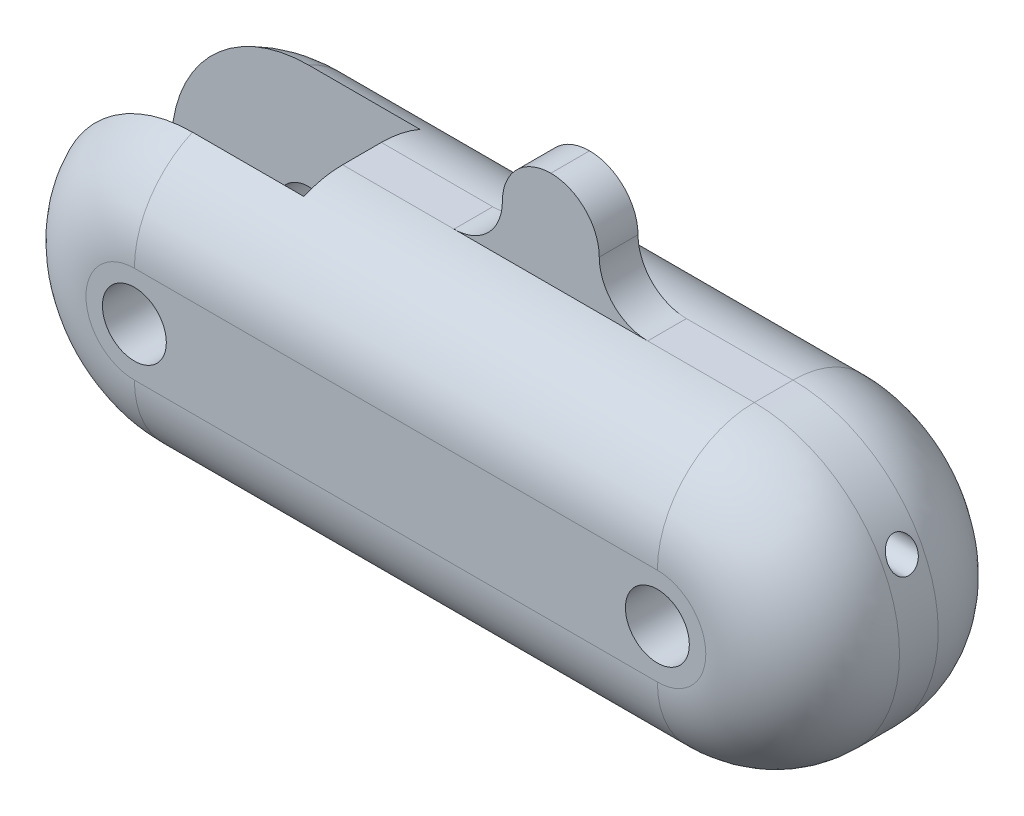
ISO-10303-21;
HEADER;
FILE_DESCRIPTION(('STEP AP214'),'2;1');
FILE_NAME('part.step','',(''),(''),'','','');
FILE_SCHEMA(('AUTOMOTIVE_DESIGN { 1 0 10303 214 1 1 1 1 }'));
ENDSEC;
DATA;
#1=APPLICATION_CONTEXT('core data for automotive mechanical design processes');
#2=APPLICATION_PROTOCOL_DEFINITION('international standard','automotive_design',2000,#1);
#3=PRODUCT_CONTEXT('',#1,'mechanical');
#4=PRODUCT('Part','Part','',(#3));
#5=PRODUCT_RELATED_PRODUCT_CATEGORY('part','',(#4));
#6=PRODUCT_DEFINITION_FORMATION('','',#4);
#7=PRODUCT_DEFINITION_CONTEXT('part definition',#1,'design');
#8=PRODUCT_DEFINITION('design','',#6,#7);
#9=PRODUCT_DEFINITION_SHAPE('','',#8);
#10=(LENGTH_UNIT() NAMED_UNIT(*) SI_UNIT(.MILLI.,.METRE.));
#11=(NAMED_UNIT(*) PLANE_ANGLE_UNIT() SI_UNIT($,.RADIAN.));
#12=(NAMED_UNIT(*) SI_UNIT($,.STERADIAN.) SOLID_ANGLE_UNIT());
#13=UNCERTAINTY_MEASURE_WITH_UNIT(LENGTH_MEASURE(1.E-05),#10,'distance_accuracy_value','');
#14=(GEOMETRIC_REPRESENTATION_CONTEXT(3) GLOBAL_UNCERTAINTY_ASSIGNED_CONTEXT((#13)) GLOBAL_UNIT_ASSIGNED_CONTEXT((#10,
#11,#12)) REPRESENTATION_CONTEXT('',''));
#15=CARTESIAN_POINT('',(0.,0.,0.));
#16=DIRECTION('',(0.,0.,1.));
#17=DIRECTION('',(1.,0.,0.));
#18=AXIS2_PLACEMENT_3D('',#15,#16,#17);
#19=CARTESIAN_POINT('',(-13.5,0.,12.));
#20=DIRECTION('',(0.,-1.,0.));
#21=DIRECTION('',(1.,0.,0.));
#22=AXIS2_PLACEMENT_3D('',#19,#20,#21);
#23=PLANE('',#22);
#24=DIRECTION('',(-1.,0.,0.));
#25=VECTOR('',#24,1.);
#26=CARTESIAN_POINT('',(-13.5,0.,7.));
#27=LINE('',#26,#25);
#28=CARTESIAN_POINT('',(-7.75,0.,7.));
#29=VERTEX_POINT('',#28);
#30=CARTESIAN_POINT('',(-2.,0.,7.));
#31=VERTEX_POINT('',#30);
#32=EDGE_CURVE('E400',#29,#31,#27,.F.);
#33=ORIENTED_EDGE('',*,*,#32,.T.);
#34=DIRECTION('',(0.,0.,1.));
#35=VECTOR('',#34,1.);
#36=CARTESIAN_POINT('',(-2.,0.,5.));
#37=LINE('',#36,#35);
#38=CARTESIAN_POINT('',(-2.,0.,5.));
#39=VERTEX_POINT('',#38);
#40=EDGE_CURVE('E302',#31,#39,#37,.F.);
#41=ORIENTED_EDGE('',*,*,#40,.T.);
#42=DIRECTION('',(-1.,0.,0.));
#43=VECTOR('',#42,1.);
#44=CARTESIAN_POINT('',(-13.5,0.,5.));
#45=LINE('',#44,#43);
#46=CARTESIAN_POINT('',(-7.75,0.,5.));
#47=VERTEX_POINT('',#46);
#48=EDGE_CURVE('E402',#39,#47,#45,.T.);
#49=ORIENTED_EDGE('',*,*,#48,.T.);
#50=DIRECTION('',(0.,0.,1.));
#51=VECTOR('',#50,1.);
#52=CARTESIAN_POINT('',(-7.75,0.,3.));
#53=LINE('',#52,#51);
#54=EDGE_CURVE('E334',#47,#29,#53,.T.);
#55=ORIENTED_EDGE('',*,*,#54,.T.);
#56=EDGE_LOOP('',(#33,#41,#49,#55));
#57=FACE_BOUND('',#56,.T.);
#58=ADVANCED_FACE('F32',(#57),#23,.F.);
#59=CARTESIAN_POINT('',(13.5,0.,5.));
#60=VERTEX_POINT('',#59);
#61=CARTESIAN_POINT('',(8.,0.,5.));
#62=VERTEX_POINT('',#61);
#63=EDGE_CURVE('E403',#60,#62,#45,.T.);
#64=ORIENTED_EDGE('',*,*,#63,.T.);
#65=DIRECTION('',(0.,0.,-1.));
#66=VECTOR('',#65,1.);
#67=CARTESIAN_POINT('',(8.,0.,7.));
#68=LINE('',#67,#66);
#69=CARTESIAN_POINT('',(8.,0.,7.));
#70=VERTEX_POINT('',#69);
#71=EDGE_CURVE('E309',#62,#70,#68,.F.);
#72=ORIENTED_EDGE('',*,*,#71,.T.);
#73=CARTESIAN_POINT('',(13.5,0.,7.));
#74=VERTEX_POINT('',#73);
#75=EDGE_CURVE('E399',#70,#74,#27,.F.);
#76=ORIENTED_EDGE('',*,*,#75,.T.);
#77=DIRECTION('',(0.,0.,-1.));
#78=VECTOR('',#77,1.);
#79=CARTESIAN_POINT('',(13.5,0.,12.));
#80=LINE('',#79,#78);
#81=EDGE_CURVE('E364',#74,#60,#80,.T.);
#82=ORIENTED_EDGE('',*,*,#81,.T.);
#83=EDGE_LOOP('',(#64,#72,#76,#82));
#84=FACE_BOUND('',#83,.T.);
#85=ADVANCED_FACE('F251',(#84),#23,.F.);
#86=CARTESIAN_POINT('',(13.5,-7.5,12.));
#87=DIRECTION('',(0.,0.,-1.));
#88=DIRECTION('',(-1.,0.,0.));
#89=AXIS2_PLACEMENT_3D('',#86,#87,#88);
#90=CYLINDRICAL_SURFACE('',#89,7.5);
#91=CARTESIAN_POINT('',(20.1332495807108,-4.,5.25));
#92=CARTESIAN_POINT('',(20.1568652100945,-4.04475712896393,5.25000069696609));
#93=CARTESIAN_POINT('',(20.1800293767484,-4.08976492895581,5.25400927517587));
#94=CARTESIAN_POINT('',(20.2248658777341,-4.1790551435472,5.27027538348579));
#95=CARTESIAN_POINT('',(20.2465380552073,-4.22333748150426,5.28253377946583));
#96=CARTESIAN_POINT('',(20.2879116758938,-4.30992682615475,5.31545723063562));
#97=CARTESIAN_POINT('',(20.3076045419242,-4.35222484491178,5.336157060362));
#98=CARTESIAN_POINT('',(20.3443674457023,-4.43298144567067,5.38577757165474));
#99=CARTESIAN_POINT('',(20.3614387598698,-4.47144189295035,5.41469423281491));
#100=CARTESIAN_POINT('',(20.3911623275913,-4.53973742839442,5.47736494318931));
#101=CARTESIAN_POINT('',(20.4040660292328,-4.57002664644258,5.51050419857445));
#102=CARTESIAN_POINT('',(20.4269531189977,-4.62455266895225,5.58231320481981));
#103=CARTESIAN_POINT('',(20.4369382953721,-4.64879317826637,5.62097954737949));
#104=CARTESIAN_POINT('',(20.4529869063967,-4.68817040363519,5.69891372918083));
#105=CARTESIAN_POINT('',(20.4593235719089,-4.70393268754241,5.73781010676271));
#106=CARTESIAN_POINT('',(20.4692604124838,-4.72879255774519,5.81800707831997));
#107=CARTESIAN_POINT('',(20.4728616243726,-4.73789266917448,5.85930675496975));
#108=CARTESIAN_POINT('',(20.4771383733366,-4.74871452689673,5.94068250069714));
#109=CARTESIAN_POINT('',(20.477964010453,-4.75081476114192,5.98070082955286));
#110=CARTESIAN_POINT('',(20.4770983322195,-4.7486184483497,6.06053083904639));
#111=CARTESIAN_POINT('',(20.4754073999443,-4.74432287488856,6.10034255021011));
#112=CARTESIAN_POINT('',(20.4695866751644,-4.72963511410702,6.17795271899596));
#113=CARTESIAN_POINT('',(20.4654973975342,-4.71934422356824,6.21577350399642));
#114=CARTESIAN_POINT('',(20.4549825205337,-4.69314838459035,6.28906769075068));
#115=CARTESIAN_POINT('',(20.4485568521372,-4.67724327028505,6.32454102311475));
#116=CARTESIAN_POINT('',(20.4333388667533,-4.6400662297977,6.39288228153309));
#117=CARTESIAN_POINT('',(20.4245047094671,-4.61869988546117,6.42568939411336));
#118=CARTESIAN_POINT('',(20.4046866646446,-4.57152680231289,6.48719637753227));
#119=CARTESIAN_POINT('',(20.3937023940896,-4.54571927245275,6.51589551500178));
#120=CARTESIAN_POINT('',(20.3691641560276,-4.48908949081757,6.57000258230613));
#121=CARTESIAN_POINT('',(20.3555068553954,-4.45807722125553,6.5951643464781));
#122=CARTESIAN_POINT('',(20.3263026183871,-4.39309447378724,6.63994971569263));
#123=CARTESIAN_POINT('',(20.3107550987679,-4.35912308374078,6.65957160512373));
#124=CARTESIAN_POINT('',(20.2767476900571,-4.28636850281494,6.69444106370555));
#125=CARTESIAN_POINT('',(20.2581540750848,-4.24741815677613,6.709208755228));
#126=CARTESIAN_POINT('',(20.21950375169,-4.16830211749591,6.73203260387971));
#127=CARTESIAN_POINT('',(20.1994464555126,-4.12813593985682,6.74008604853172));
#128=CARTESIAN_POINT('',(20.1563085373537,-4.04369983150148,6.75004397376913));
#129=CARTESIAN_POINT('',(20.1331223675881,-3.99940542782165,6.75128539519353));
#130=CARTESIAN_POINT('',(20.0860588230827,-3.91164199428551,6.74607476207137));
#131=CARTESIAN_POINT('',(20.0621811684306,-3.86817331081142,6.73961954823108));
#132=CARTESIAN_POINT('',(20.0124790173255,-3.77973344935155,6.71847576043198));
#133=CARTESIAN_POINT('',(19.986647679833,-3.73490877068937,6.7031853128459));
#134=CARTESIAN_POINT('',(19.9357343535149,-3.64852752977386,6.66423898345623));
#135=CARTESIAN_POINT('',(19.9106529100033,-3.60697331155975,6.64057716719651));
#136=CARTESIAN_POINT('',(19.8621650327383,-3.52822396654695,6.58503138384834));
#137=CARTESIAN_POINT('',(19.8387675581801,-3.49105156771564,6.55310707545873));
#138=CARTESIAN_POINT('',(19.7951208610375,-3.42285769464486,6.48149765334738));
#139=CARTESIAN_POINT('',(19.7748655342586,-3.39182426121488,6.44182793409188));
#140=CARTESIAN_POINT('',(19.7441296604099,-3.34531674164022,6.36773463912216));
#141=CARTESIAN_POINT('',(19.7325031742713,-3.32792254459538,6.33498389337065));
#142=CARTESIAN_POINT('',(19.7123269530317,-3.29793850852277,6.26646615448601));
#143=CARTESIAN_POINT('',(19.7037747168345,-3.28534476351841,6.23070164261997));
#144=CARTESIAN_POINT('',(19.6902984185428,-3.26557533684953,6.15681284743056));
#145=CARTESIAN_POINT('',(19.6853946024228,-3.2584298837293,6.11867665017429));
#146=CARTESIAN_POINT('',(19.6797033076017,-3.25014186597953,6.04145384644772));
#147=CARTESIAN_POINT('',(19.6789142561407,-3.2489970077805,6.00236760884515));
#148=CARTESIAN_POINT('',(19.6813931710046,-3.25260309406563,5.92827495646399));
#149=CARTESIAN_POINT('',(19.6842899276402,-3.25681456761362,5.8932277732572));
#150=CARTESIAN_POINT('',(19.693308211172,-3.26998861428829,5.82447604328706));
#151=CARTESIAN_POINT('',(19.6994299026124,-3.27895142984032,5.79077156512622));
#152=CARTESIAN_POINT('',(19.7146133796125,-3.30133780469566,5.72505739919943));
#153=CARTESIAN_POINT('',(19.7237143408386,-3.31482086291967,5.69307729890249));
#154=CARTESIAN_POINT('',(19.7443359325697,-3.3456514298456,5.63189268510943));
#155=CARTESIAN_POINT('',(19.755857406406,-3.36300028555895,5.60268914415963));
#156=CARTESIAN_POINT('',(19.7823887723703,-3.40338626249218,5.54395537476474));
#157=CARTESIAN_POINT('',(19.7976550846796,-3.42686421313566,5.51484516788648));
#158=CARTESIAN_POINT('',(19.8299678350555,-3.47726403649822,5.46091603715502));
#159=CARTESIAN_POINT('',(19.8470153888876,-3.50418807023977,5.43609982921319));
#160=CARTESIAN_POINT('',(19.8852466837685,-3.56551988782084,5.3872131735081));
#161=CARTESIAN_POINT('',(19.9066486852218,-3.60042939812047,5.3639419420298));
#162=CARTESIAN_POINT('',(19.9503628456514,-3.67317076129835,5.32367729284258));
#163=CARTESIAN_POINT('',(19.9726753450833,-3.71100371213012,5.30668624776824));
#164=CARTESIAN_POINT('',(20.0182375061319,-3.78991735324902,5.27877439425189));
#165=CARTESIAN_POINT('',(20.0414956207365,-3.83106029081337,5.26804311416663));
#166=CARTESIAN_POINT('',(20.0877229967265,-3.91472586515507,5.25365538695503));
#167=CARTESIAN_POINT('',(20.1106922419369,-3.95724857871951,5.24999933426715));
#168=CARTESIAN_POINT('',(20.1332495807108,-4.,5.25));
#169=B_SPLINE_CURVE_WITH_KNOTS('',3,(#91,#92,#93,#94,#95,#96,#97,#98,#99,#100,#101,#102,#103,
#104,#105,#106,#107,#108,#109,#110,#111,#112,#113,#114,#115,#116,#117,#118,#119,#120,#121,#122,
#123,#124,#125,#126,#127,#128,#129,#130,#131,#132,#133,#134,#135,#136,#137,#138,#139,#140,#141,
#142,#143,#144,#145,#146,#147,#148,#149,#150,#151,#152,#153,#154,#155,#156,#157,#158,#159,#160,
#161,#162,#163,#164,#165,#166,#167,#168),.UNSPECIFIED.,.T.,.F.,(4,2,2,2,2,2,2,2,2,2,2,2,2,2,2,2,
2,2,2,2,2,2,2,2,2,2,2,2,2,2,2,2,2,2,2,2,2,2,4),(0.,0.151661005421159,0.303337931279044,
0.455646106620901,0.60787988717372,0.747256765609742,0.886548064567127,1.0132272857131,
1.1398584673014,1.25952084912075,1.37916501767401,1.49684401087809,1.61452648107235,
1.73440026024666,1.85429541305983,1.98037574012026,2.1064950695399,2.24277688192367,
2.37911372392492,2.52851299639749,2.6779736149916,2.83907034561563,3.00028150715967,
3.1622951331674,3.32398996653118,3.44011001590394,3.55613537933344,3.67279988942347,
3.78941980432112,3.89517224873058,4.00093008941375,4.10813854282546,4.21538441088788,
4.33610582335719,4.45690331400404,4.59763975196048,4.73842930548273,4.88328582896064,
5.02815042784518),.UNSPECIFIED.);
#170=CARTESIAN_POINT('',(20.1332495807108,-4.,5.25));
#171=VERTEX_POINT('',#170);
#172=EDGE_CURVE('E180',#171,#171,#169,.T.);
#173=ORIENTED_EDGE('',*,*,#172,.T.);
#174=EDGE_LOOP('',(#173));
#175=FACE_BOUND('',#174,.T.);
#176=DIRECTION('',(0.,0.,-1.));
#177=VECTOR('',#176,1.);
#178=CARTESIAN_POINT('',(13.5,-15.,12.));
#179=LINE('',#178,#177);
#180=CARTESIAN_POINT('',(13.5,-15.,7.));
#181=VERTEX_POINT('',#180);
#182=CARTESIAN_POINT('',(13.5,-15.,5.));
#183=VERTEX_POINT('',#182);
#184=EDGE_CURVE('E361',#181,#183,#179,.T.);
#185=ORIENTED_EDGE('',*,*,#184,.T.);
#186=CARTESIAN_POINT('',(13.5,-7.5,5.));
#187=DIRECTION('',(0.,0.,-1.));
#188=DIRECTION('',(-1.,0.,0.));
#189=AXIS2_PLACEMENT_3D('',#186,#187,#188);
#190=CIRCLE('',#189,7.5);
#191=EDGE_CURVE('E371',#183,#60,#190,.F.);
#192=ORIENTED_EDGE('',*,*,#191,.T.);
#193=ORIENTED_EDGE('',*,*,#81,.F.);
#194=CARTESIAN_POINT('',(13.5,-7.5,7.));
#195=DIRECTION('',(0.,0.,-1.));
#196=DIRECTION('',(-1.,0.,0.));
#197=AXIS2_PLACEMENT_3D('',#194,#195,#196);
#198=CIRCLE('',#197,7.5);
#199=EDGE_CURVE('E368',#74,#181,#198,.T.);
#200=ORIENTED_EDGE('',*,*,#199,.T.);
#201=EDGE_LOOP('',(#185,#192,#193,#200));
#202=FACE_BOUND('',#201,.T.);
#203=ADVANCED_FACE('F256',(#175,#202),#90,.T.);
#204=CARTESIAN_POINT('',(-13.5,-15.,12.));
#205=DIRECTION('',(0.,1.,0.));
#206=DIRECTION('',(-1.,0.,0.));
#207=AXIS2_PLACEMENT_3D('',#204,#205,#206);
#208=PLANE('',#207);
#209=DIRECTION('',(0.,0.,1.));
#210=VECTOR('',#209,1.);
#211=CARTESIAN_POINT('',(7.5,-15.,12.));
#212=LINE('',#211,#210);
#213=CARTESIAN_POINT('',(7.5,-15.,5.25));
#214=VERTEX_POINT('',#213);
#215=CARTESIAN_POINT('',(7.5,-15.,6.75));
#216=VERTEX_POINT('',#215);
#217=EDGE_CURVE('E11',#214,#216,#212,.T.);
#218=ORIENTED_EDGE('',*,*,#217,.F.);
#219=CARTESIAN_POINT('',(7.5,-15.,5.25));
#220=CARTESIAN_POINT('',(7.38300350435634,-15.0000000000001,5.25003049225254));
#221=CARTESIAN_POINT('',(7.26600077168436,-15.0000000000001,5.2518852935411));
#222=CARTESIAN_POINT('',(7.03204698100777,-14.9999999999999,5.25945747622457));
#223=CARTESIAN_POINT('',(6.91509600331971,-14.9999999999999,5.26517731586243));
#224=CARTESIAN_POINT('',(6.68144997471838,-14.9999999999999,5.28069465094905));
#225=CARTESIAN_POINT('',(6.56475494471956,-15.,5.29049246799662));
#226=CARTESIAN_POINT('',(6.33186825007688,-15.,5.31465228488095));
#227=CARTESIAN_POINT('',(6.21567644752542,-15.,5.32901294195021));
#228=CARTESIAN_POINT('',(5.98410722514944,-15.,5.36311292082938));
#229=CARTESIAN_POINT('',(5.86872946366168,-15.,5.38284982905293));
#230=CARTESIAN_POINT('',(5.69668561241214,-15.,5.41765325355828));
#231=CARTESIAN_POINT('',(5.63949297663591,-15.,5.43012476779558));
#232=CARTESIAN_POINT('',(5.525600410652,-15.,5.4571258579921));
#233=CARTESIAN_POINT('',(5.46890038472301,-15.,5.47165502417627));
#234=CARTESIAN_POINT('',(5.36830072836001,-15.,5.49984306224709));
#235=CARTESIAN_POINT('',(5.32426670565677,-15.,5.51301895411967));
#236=CARTESIAN_POINT('',(5.23678513147282,-15.,5.54126847030076));
#237=CARTESIAN_POINT('',(5.19333787151577,-15.,5.55634300210139));
#238=CARTESIAN_POINT('',(5.10346593806894,-15.,5.59032670931334));
#239=CARTESIAN_POINT('',(5.05712275918912,-15.,5.60945832264995));
#240=CARTESIAN_POINT('',(4.98894838987684,-15.,5.64105344565066));
#241=CARTESIAN_POINT('',(4.96644675031386,-15.,5.65206824633071));
#242=CARTESIAN_POINT('',(4.9220605881731,-15.,5.6752717154596));
#243=CARTESIAN_POINT('',(4.90017584445451,-15.,5.68745995616133));
#244=CARTESIAN_POINT('',(4.85422130861575,-15.,5.71511651420061));
#245=CARTESIAN_POINT('',(4.83028230822118,-15.,5.730804848396));
#246=CARTESIAN_POINT('',(4.784183610453,-15.,5.76465202194409));
#247=CARTESIAN_POINT('',(4.76202200881714,-15.,5.78280815957496));
#248=CARTESIAN_POINT('',(4.72845321337415,-15.,5.81509270167101));
#249=CARTESIAN_POINT('',(4.71610033044275,-15.,5.82822659471855));
#250=CARTESIAN_POINT('',(4.69326461221869,-15.,5.85604799405909));
#251=CARTESIAN_POINT('',(4.68277874190684,-15.,5.87073291590982));
#252=CARTESIAN_POINT('',(4.66718244945662,-15.,5.89739872227531));
#253=CARTESIAN_POINT('',(4.66138995536859,-15.,5.9089751089358));
#254=CARTESIAN_POINT('',(4.65172604209125,-15.,5.93289511778927));
#255=CARTESIAN_POINT('',(4.647850213279,-15.,5.94523690466095));
#256=CARTESIAN_POINT('',(4.64241365739102,-15.,5.97057700216676));
#257=CARTESIAN_POINT('',(4.6408783474761,-15.,5.98358095752878));
#258=CARTESIAN_POINT('',(4.64043015065258,-15.,6.00963441548878));
#259=CARTESIAN_POINT('',(4.64151669415981,-15.,6.02268390757915));
#260=CARTESIAN_POINT('',(4.64582228046097,-15.,6.04653826414021));
#261=CARTESIAN_POINT('',(4.6487243632164,-15.,6.05740325811017));
#262=CARTESIAN_POINT('',(4.65608224216356,-15.,6.07860471569457));
#263=CARTESIAN_POINT('',(4.66054099175578,-15.,6.08894013151154));
#264=CARTESIAN_POINT('',(4.67401217139293,-15.,6.11548973814853));
#265=CARTESIAN_POINT('',(4.68409998028603,-15.,6.13115421797826));
#266=CARTESIAN_POINT('',(4.70650757107073,-15.,6.16078599039004));
#267=CARTESIAN_POINT('',(4.71883373872406,-15.,6.17474823113608));
#268=CARTESIAN_POINT('',(4.74473581952743,-15.,6.20098802630621));
#269=CARTESIAN_POINT('',(4.75828806204029,-15.,6.21328934998106));
#270=CARTESIAN_POINT('',(4.78634711727584,-15.,6.23668979079081));
#271=CARTESIAN_POINT('',(4.8008526474155,-15.,6.24779047214886));
#272=CARTESIAN_POINT('',(4.84548279912952,-15.,6.27969736067298));
#273=CARTESIAN_POINT('',(4.87664859164849,-15.,6.29904093628914));
#274=CARTESIAN_POINT('',(4.93557445288214,-15.,6.33217126267271));
#275=CARTESIAN_POINT('',(4.96312084280277,-15.,6.34635507445738));
#276=CARTESIAN_POINT('',(5.01897437788017,-15.,6.37315304893338));
#277=CARTESIAN_POINT('',(5.0472817391534,-15.,6.38576675986401));
#278=CARTESIAN_POINT('',(5.13293222658585,-15.,6.4216902991967));
#279=CARTESIAN_POINT('',(5.19106200731165,-15.,6.44311323677659));
#280=CARTESIAN_POINT('',(5.30818336378917,-15.,6.48228338167273));
#281=CARTESIAN_POINT('',(5.36716916178879,-15.,6.50004846930542));
#282=CARTESIAN_POINT('',(5.48587874135395,-15.,6.53283778755026));
#283=CARTESIAN_POINT('',(5.54560237644896,-15.,6.54786255310647));
#284=CARTESIAN_POINT('',(5.66559174426151,-15.,6.57569922877757));
#285=CARTESIAN_POINT('',(5.7258577599358,-15.,6.58850990383832));
#286=CARTESIAN_POINT('',(5.84676184997887,-15.,6.61225066079973));
#287=CARTESIAN_POINT('',(5.90739996419747,-15.,6.62318053750342));
#288=CARTESIAN_POINT('',(6.08975859115311,-14.9999999999999,6.65353449532541));
#289=CARTESIAN_POINT('',(6.21188908074138,-14.9999999999996,6.67051528728783));
#290=CARTESIAN_POINT('',(6.43085114852698,-15.0000000000003,6.69614718430745));
#291=CARTESIAN_POINT('',(6.52757107009397,-15.000000000001,6.70580039450062));
#292=CARTESIAN_POINT('',(6.72123578729676,-14.999999999999,6.72214097299936));
#293=CARTESIAN_POINT('',(6.81818051545122,-14.9999999999962,6.72882913832664));
#294=CARTESIAN_POINT('',(7.01253145748996,-14.9999999999958,6.73948147048887));
#295=CARTESIAN_POINT('',(7.10993814962772,-14.9999999999982,6.74343675345185));
#296=CARTESIAN_POINT('',(7.30489724849429,-15.0000000000018,6.74868995091089));
#297=CARTESIAN_POINT('',(7.40244970971306,-15.0000000000029,6.74998585626488));
#298=CARTESIAN_POINT('',(7.5,-15.,6.75));
#299=B_SPLINE_CURVE_WITH_KNOTS('',3,(#219,#220,#221,#222,#223,#224,#225,#226,#227,#228,#229,
#230,#231,#232,#233,#234,#235,#236,#237,#238,#239,#240,#241,#242,#243,#244,#245,#246,#247,#248,
#249,#250,#251,#252,#253,#254,#255,#256,#257,#258,#259,#260,#261,#262,#263,#264,#265,#266,#267,
#268,#269,#270,#271,#272,#273,#274,#275,#276,#277,#278,#279,#280,#281,#282,#283,#284,#285,#286,
#287,#288,#289,#290,#291,#292,#293,#294,#295,#296,#297,#298),.UNSPECIFIED.,.F.,.F.,(4,2,2,2,2,2,
2,2,2,2,2,2,2,2,2,2,2,2,2,2,2,2,2,2,2,2,2,2,2,2,2,2,2,2,2,2,2,2,2,4),(0.,0.350984704651211,
0.702192853087216,1.05342870386592,1.40456128739414,1.75553649433973,1.93111798740311,
2.1066645629938,2.24451820058902,2.3824379798703,2.5327001340723,2.60783292937421,
2.68293843992098,2.76870491818355,2.85437824547416,2.90835975141255,2.96225268739427,
3.00095523159889,3.03956831471348,3.07859780720025,3.11761882149386,3.15122313550509,
3.1848915552236,3.24046315194215,3.29619585204808,3.35101927080176,3.40577038149266,
3.51556684743488,3.60847182622728,3.70140347481978,3.88707005883597,4.07180631241158,
4.25650646454324,4.44130931508083,4.62613231502887,4.99588359430547,5.28744363291152,
5.57892525085248,5.87134999549345,6.16399558386973),.UNSPECIFIED.);
#300=EDGE_CURVE('E172',#214,#216,#299,.T.);
#301=ORIENTED_EDGE('',*,*,#300,.T.);
#302=EDGE_LOOP('',(#218,#301));
#303=FACE_BOUND('',#302,.T.);
#304=DIRECTION('',(1.,0.,0.));
#305=VECTOR('',#304,1.);
#306=CARTESIAN_POINT('',(-13.5,-15.,7.));
#307=LINE('',#306,#305);
#308=CARTESIAN_POINT('',(-7.75,-15.,7.));
#309=VERTEX_POINT('',#308);
#310=EDGE_CURVE('E384',#181,#309,#307,.F.);
#311=ORIENTED_EDGE('',*,*,#310,.T.);
#312=DIRECTION('',(0.,0.,-1.));
#313=VECTOR('',#312,1.);
#314=CARTESIAN_POINT('',(-7.75,-15.,12.));
#315=LINE('',#314,#313);
#316=CARTESIAN_POINT('',(-7.75,-15.,5.));
#317=VERTEX_POINT('',#316);
#318=EDGE_CURVE('E349',#309,#317,#315,.T.);
#319=ORIENTED_EDGE('',*,*,#318,.T.);
#320=DIRECTION('',(1.,0.,0.));
#321=VECTOR('',#320,1.);
#322=CARTESIAN_POINT('',(13.5,-15.,5.));
#323=LINE('',#322,#321);
#324=EDGE_CURVE('E387',#317,#183,#323,.T.);
#325=ORIENTED_EDGE('',*,*,#324,.T.);
#326=ORIENTED_EDGE('',*,*,#184,.F.);
#327=EDGE_LOOP('',(#311,#319,#325,#326));
#328=FACE_BOUND('',#327,.T.);
#329=ADVANCED_FACE('F175',(#303,#328),#208,.F.);
#330=CARTESIAN_POINT('',(13.5,-7.5,12.));
#331=DIRECTION('',(0.,0.,-1.));
#332=DIRECTION('',(-1.,0.,0.));
#333=AXIS2_PLACEMENT_3D('',#330,#331,#332);
#334=PLANE('',#333);
#335=CARTESIAN_POINT('',(13.5,-7.5,12.));
#336=DIRECTION('',(0.,0.,1.));
#337=DIRECTION('',(1.,0.,0.));
#338=AXIS2_PLACEMENT_3D('',#335,#336,#337);
#339=CIRCLE('',#338,1.65);
#340=CARTESIAN_POINT('',(15.15,-7.5,12.));
#341=VERTEX_POINT('',#340);
#342=EDGE_CURVE('E330',#341,#341,#339,.T.);
#343=ORIENTED_EDGE('',*,*,#342,.F.);
#344=EDGE_LOOP('',(#343));
#345=FACE_BOUND('',#344,.T.);
#346=CARTESIAN_POINT('',(-13.5,-7.5,12.));
#347=DIRECTION('',(0.,0.,1.));
#348=DIRECTION('',(1.,0.,0.));
#349=AXIS2_PLACEMENT_3D('',#346,#347,#348);
#350=CIRCLE('',#349,1.65);
#351=CARTESIAN_POINT('',(-11.85,-7.5,12.));
#352=VERTEX_POINT('',#351);
#353=EDGE_CURVE('E323',#352,#352,#350,.T.);
#354=ORIENTED_EDGE('',*,*,#353,.F.);
#355=EDGE_LOOP('',(#354));
#356=FACE_BOUND('',#355,.T.);
#357=DIRECTION('',(1.,0.,0.));
#358=VECTOR('',#357,1.);
#359=CARTESIAN_POINT('',(13.5,-10.,12.));
#360=LINE('',#359,#358);
#361=CARTESIAN_POINT('',(-13.5,-10.,12.));
#362=VERTEX_POINT('',#361);
#363=CARTESIAN_POINT('',(13.5,-10.,12.));
#364=VERTEX_POINT('',#363);
#365=EDGE_CURVE('E394',#362,#364,#360,.T.);
#366=ORIENTED_EDGE('',*,*,#365,.T.);
#367=CARTESIAN_POINT('',(13.5,-7.5,12.));
#368=DIRECTION('',(0.,0.,-1.));
#369=DIRECTION('',(-1.,0.,0.));
#370=AXIS2_PLACEMENT_3D('',#367,#368,#369);
#371=CIRCLE('',#370,2.5);
#372=CARTESIAN_POINT('',(13.5,-5.,12.));
#373=VERTEX_POINT('',#372);
#374=EDGE_CURVE('E396',#364,#373,#371,.F.);
#375=ORIENTED_EDGE('',*,*,#374,.T.);
#376=DIRECTION('',(-1.,0.,0.));
#377=VECTOR('',#376,1.);
#378=CARTESIAN_POINT('',(13.5,-5.,12.));
#379=LINE('',#378,#377);
#380=CARTESIAN_POINT('',(-13.5,-5.,12.));
#381=VERTEX_POINT('',#380);
#382=EDGE_CURVE('E389',#373,#381,#379,.T.);
#383=ORIENTED_EDGE('',*,*,#382,.T.);
#384=CARTESIAN_POINT('',(-13.5,-7.5,12.));
#385=DIRECTION('',(0.,0.,-1.));
#386=DIRECTION('',(-1.,0.,0.));
#387=AXIS2_PLACEMENT_3D('',#384,#385,#386);
#388=CIRCLE('',#387,2.5);
#389=EDGE_CURVE('E392',#381,#362,#388,.F.);
#390=ORIENTED_EDGE('',*,*,#389,.T.);
#391=EDGE_LOOP('',(#366,#375,#383,#390));
#392=FACE_BOUND('',#391,.T.);
#393=ADVANCED_FACE('F235',(#345,#356,#392),#334,.F.);
#394=CARTESIAN_POINT('',(13.5,-7.5,0.));
#395=DIRECTION('',(0.,0.,-1.));
#396=DIRECTION('',(-1.,0.,0.));
#397=AXIS2_PLACEMENT_3D('',#394,#395,#396);
#398=PLANE('',#397);
#399=CARTESIAN_POINT('',(13.5,-7.5,0.));
#400=DIRECTION('',(0.,0.,1.));
#401=DIRECTION('',(1.,0.,0.));
#402=AXIS2_PLACEMENT_3D('',#399,#400,#401);
#403=CIRCLE('',#402,1.65);
#404=CARTESIAN_POINT('',(15.15,-7.5,0.));
#405=VERTEX_POINT('',#404);
#406=EDGE_CURVE('E327',#405,#405,#403,.T.);
#407=ORIENTED_EDGE('',*,*,#406,.T.);
#408=EDGE_LOOP('',(#407));
#409=FACE_BOUND('',#408,.T.);
#410=CARTESIAN_POINT('',(-13.5,-7.5,0.));
#411=DIRECTION('',(0.,0.,1.));
#412=DIRECTION('',(1.,0.,0.));
#413=AXIS2_PLACEMENT_3D('',#410,#411,#412);
#414=CIRCLE('',#413,1.65);
#415=CARTESIAN_POINT('',(-11.85,-7.5,0.));
#416=VERTEX_POINT('',#415);
#417=EDGE_CURVE('E317',#416,#416,#414,.T.);
#418=ORIENTED_EDGE('',*,*,#417,.T.);
#419=EDGE_LOOP('',(#418));
#420=FACE_BOUND('',#419,.T.);
#421=DIRECTION('',(-1.,0.,0.));
#422=VECTOR('',#421,1.);
#423=CARTESIAN_POINT('',(13.5,-4.99999999999999,0.));
#424=LINE('',#423,#422);
#425=CARTESIAN_POINT('',(-13.5,-5.,0.));
#426=VERTEX_POINT('',#425);
#427=CARTESIAN_POINT('',(13.5,-4.99999999999999,0.));
#428=VERTEX_POINT('',#427);
#429=EDGE_CURVE('E374',#426,#428,#424,.F.);
#430=ORIENTED_EDGE('',*,*,#429,.T.);
#431=CARTESIAN_POINT('',(13.5,-7.5,0.));
#432=DIRECTION('',(0.,0.,-1.));
#433=DIRECTION('',(-1.,0.,0.));
#434=AXIS2_PLACEMENT_3D('',#431,#432,#433);
#435=CIRCLE('',#434,2.5);
#436=CARTESIAN_POINT('',(13.5,-10.,0.));
#437=VERTEX_POINT('',#436);
#438=EDGE_CURVE('E381',#428,#437,#435,.T.);
#439=ORIENTED_EDGE('',*,*,#438,.T.);
#440=DIRECTION('',(1.,0.,0.));
#441=VECTOR('',#440,1.);
#442=CARTESIAN_POINT('',(-13.5,-10.,0.));
#443=LINE('',#442,#441);
#444=CARTESIAN_POINT('',(-13.5,-10.,0.));
#445=VERTEX_POINT('',#444);
#446=EDGE_CURVE('E378',#437,#445,#443,.F.);
#447=ORIENTED_EDGE('',*,*,#446,.T.);
#448=CARTESIAN_POINT('',(-13.5,-7.5,0.));
#449=DIRECTION('',(0.,0.,-1.));
#450=DIRECTION('',(-1.,0.,0.));
#451=AXIS2_PLACEMENT_3D('',#448,#449,#450);
#452=CIRCLE('',#451,2.5);
#453=EDGE_CURVE('E376',#445,#426,#452,.T.);
#454=ORIENTED_EDGE('',*,*,#453,.T.);
#455=EDGE_LOOP('',(#430,#439,#447,#454));
#456=FACE_BOUND('',#455,.T.);
#457=ADVANCED_FACE('F237',(#409,#420,#456),#398,.T.);
#458=CARTESIAN_POINT('',(-13.5,-7.5,5.));
#459=DIRECTION('',(0.,0.,-1.));
#460=DIRECTION('',(-1.,0.,0.));
#461=AXIS2_PLACEMENT_3D('',#458,#459,#460);
#462=DEGENERATE_TOROIDAL_SURFACE('',#461,2.5,5.,.T.);
#463=CARTESIAN_POINT('',(-13.5,-7.5,3.));
#464=DIRECTION('',(0.,0.,-1.));
#465=DIRECTION('',(-1.,0.,0.));
#466=AXIS2_PLACEMENT_3D('',#463,#464,#465);
#467=CIRCLE('',#466,7.08257569495584);
#468=CARTESIAN_POINT('',(-13.5,-0.417424305044161,3.));
#469=VERTEX_POINT('',#468);
#470=CARTESIAN_POINT('',(-13.5,-14.5825756949558,3.));
#471=VERTEX_POINT('',#470);
#472=EDGE_CURVE('E356',#469,#471,#467,.F.);
#473=ORIENTED_EDGE('',*,*,#472,.F.);
#474=CARTESIAN_POINT('',(-13.5,-5.,5.));
#475=DIRECTION('',(1.,0.,0.));
#476=DIRECTION('',(0.,1.,0.));
#477=AXIS2_PLACEMENT_3D('',#474,#475,#476);
#478=CIRCLE('',#477,5.);
#479=EDGE_CURVE('E411',#426,#469,#478,.T.);
#480=ORIENTED_EDGE('',*,*,#479,.F.);
#481=ORIENTED_EDGE('',*,*,#453,.F.);
#482=CARTESIAN_POINT('',(-13.5,-10.,5.));
#483=DIRECTION('',(1.,0.,0.));
#484=DIRECTION('',(0.,1.,0.));
#485=AXIS2_PLACEMENT_3D('',#482,#483,#484);
#486=CIRCLE('',#485,5.);
#487=EDGE_CURVE('E365',#471,#445,#486,.T.);
#488=ORIENTED_EDGE('',*,*,#487,.F.);
#489=EDGE_LOOP('',(#473,#480,#481,#488));
#490=FACE_BOUND('',#489,.T.);
#491=ADVANCED_FACE('F240',(#490),#462,.T.);
#492=CARTESIAN_POINT('',(-13.5,-10.,5.));
#493=DIRECTION('',(-1.,0.,0.));
#494=DIRECTION('',(0.,-1.,0.));
#495=AXIS2_PLACEMENT_3D('',#492,#493,#494);
#496=CYLINDRICAL_SURFACE('',#495,5.);
#497=CARTESIAN_POINT('',(-7.75,-10.,5.));
#498=DIRECTION('',(1.,0.,0.));
#499=DIRECTION('',(0.,0.,-1.));
#500=AXIS2_PLACEMENT_3D('',#497,#498,#499);
#501=CIRCLE('',#500,5.);
#502=CARTESIAN_POINT('',(-7.75,-14.5825756949558,3.));
#503=VERTEX_POINT('',#502);
#504=EDGE_CURVE('E352',#503,#317,#501,.F.);
#505=ORIENTED_EDGE('',*,*,#504,.F.);
#506=DIRECTION('',(-1.,0.,0.));
#507=VECTOR('',#506,1.);
#508=CARTESIAN_POINT('',(-13.5,-14.5825756949558,3.));
#509=LINE('',#508,#507);
#510=EDGE_CURVE('E358',#471,#503,#509,.F.);
#511=ORIENTED_EDGE('',*,*,#510,.F.);
#512=ORIENTED_EDGE('',*,*,#487,.T.);
#513=ORIENTED_EDGE('',*,*,#446,.F.);
#514=CARTESIAN_POINT('',(13.5,-10.,5.));
#515=DIRECTION('',(1.,0.,0.));
#516=DIRECTION('',(0.,0.,-1.));
#517=AXIS2_PLACEMENT_3D('',#514,#515,#516);
#518=CIRCLE('',#517,5.);
#519=EDGE_CURVE('E408',#183,#437,#518,.T.);
#520=ORIENTED_EDGE('',*,*,#519,.F.);
#521=ORIENTED_EDGE('',*,*,#324,.F.);
#522=EDGE_LOOP('',(#505,#511,#512,#513,#520,#521));
#523=FACE_BOUND('',#522,.T.);
#524=ADVANCED_FACE('F245',(#523),#496,.T.);
#525=CARTESIAN_POINT('',(-13.5,-5.,5.));
#526=DIRECTION('',(1.,0.,0.));
#527=DIRECTION('',(0.,1.,0.));
#528=AXIS2_PLACEMENT_3D('',#525,#526,#527);
#529=CYLINDRICAL_SURFACE('',#528,5.);
#530=CARTESIAN_POINT('',(-7.75,-5.,5.));
#531=DIRECTION('',(1.,0.,0.));
#532=DIRECTION('',(0.,0.,-1.));
#533=AXIS2_PLACEMENT_3D('',#530,#531,#532);
#534=CIRCLE('',#533,5.);
#535=CARTESIAN_POINT('',(-7.75,-0.41742430504416,3.));
#536=VERTEX_POINT('',#535);
#537=EDGE_CURVE('E354',#47,#536,#534,.F.);
#538=ORIENTED_EDGE('',*,*,#537,.F.);
#539=ORIENTED_EDGE('',*,*,#48,.F.);
#540=DIRECTION('',(-1.,0.,0.));
#541=VECTOR('',#540,1.);
#542=CARTESIAN_POINT('',(0.5,0.,5.));
#543=LINE('',#542,#541);
#544=EDGE_CURVE('E54',#62,#39,#543,.T.);
#545=ORIENTED_EDGE('',*,*,#544,.F.);
#546=ORIENTED_EDGE('',*,*,#63,.F.);
#547=CARTESIAN_POINT('',(13.5,-4.99999999999999,5.));
#548=DIRECTION('',(1.,0.,0.));
#549=DIRECTION('',(0.,0.,-1.));
#550=AXIS2_PLACEMENT_3D('',#547,#548,#549);
#551=CIRCLE('',#550,5.);
#552=EDGE_CURVE('E406',#428,#60,#551,.T.);
#553=ORIENTED_EDGE('',*,*,#552,.F.);
#554=ORIENTED_EDGE('',*,*,#429,.F.);
#555=ORIENTED_EDGE('',*,*,#479,.T.);
#556=DIRECTION('',(1.,0.,0.));
#557=VECTOR('',#556,1.);
#558=CARTESIAN_POINT('',(-13.5,-0.417424305044161,3.));
#559=LINE('',#558,#557);
#560=EDGE_CURVE('E425',#536,#469,#559,.F.);
#561=ORIENTED_EDGE('',*,*,#560,.F.);
#562=EDGE_LOOP('',(#538,#539,#545,#546,#553,#554,#555,#561));
#563=FACE_BOUND('',#562,.T.);
#564=ADVANCED_FACE('F267',(#563),#529,.T.);
#565=CARTESIAN_POINT('',(13.5,-7.5,5.));
#566=DIRECTION('',(0.,0.,-1.));
#567=DIRECTION('',(-1.,0.,0.));
#568=AXIS2_PLACEMENT_3D('',#565,#566,#567);
#569=DEGENERATE_TOROIDAL_SURFACE('',#568,2.5,5.,.T.);
#570=ORIENTED_EDGE('',*,*,#519,.T.);
#571=ORIENTED_EDGE('',*,*,#438,.F.);
#572=ORIENTED_EDGE('',*,*,#552,.T.);
#573=ORIENTED_EDGE('',*,*,#191,.F.);
#574=EDGE_LOOP('',(#570,#571,#572,#573));
#575=FACE_BOUND('',#574,.T.);
#576=ADVANCED_FACE('F263',(#575),#569,.T.);
#577=CARTESIAN_POINT('',(-13.5,-7.5,7.));
#578=DIRECTION('',(0.,0.,-1.));
#579=DIRECTION('',(-1.,0.,0.));
#580=AXIS2_PLACEMENT_3D('',#577,#578,#579);
#581=DEGENERATE_TOROIDAL_SURFACE('',#580,2.5,5.,.T.);
#582=CARTESIAN_POINT('',(-13.5,-7.5,9.));
#583=DIRECTION('',(0.,0.,1.));
#584=DIRECTION('',(1.,0.,0.));
#585=AXIS2_PLACEMENT_3D('',#582,#583,#584);
#586=CIRCLE('',#585,7.08257569495584);
#587=CARTESIAN_POINT('',(-13.5,-14.5825756949558,9.));
#588=VERTEX_POINT('',#587);
#589=CARTESIAN_POINT('',(-13.5,-0.417424305044161,9.));
#590=VERTEX_POINT('',#589);
#591=EDGE_CURVE('E341',#588,#590,#586,.F.);
#592=ORIENTED_EDGE('',*,*,#591,.F.);
#593=CARTESIAN_POINT('',(-13.5,-10.,7.));
#594=DIRECTION('',(1.,0.,0.));
#595=DIRECTION('',(0.,0.,-1.));
#596=AXIS2_PLACEMENT_3D('',#593,#594,#595);
#597=CIRCLE('',#596,5.);
#598=EDGE_CURVE('E409',#362,#588,#597,.T.);
#599=ORIENTED_EDGE('',*,*,#598,.F.);
#600=ORIENTED_EDGE('',*,*,#389,.F.);
#601=CARTESIAN_POINT('',(-13.5,-5.,7.));
#602=DIRECTION('',(1.,0.,0.));
#603=DIRECTION('',(0.,1.,0.));
#604=AXIS2_PLACEMENT_3D('',#601,#602,#603);
#605=CIRCLE('',#604,5.);
#606=EDGE_CURVE('E418',#590,#381,#605,.T.);
#607=ORIENTED_EDGE('',*,*,#606,.F.);
#608=EDGE_LOOP('',(#592,#599,#600,#607));
#609=FACE_BOUND('',#608,.T.);
#610=ADVANCED_FACE('F266',(#609),#581,.T.);
#611=CARTESIAN_POINT('',(13.5,-10.,7.));
#612=DIRECTION('',(1.,0.,0.));
#613=DIRECTION('',(0.,1.,0.));
#614=AXIS2_PLACEMENT_3D('',#611,#612,#613);
#615=CYLINDRICAL_SURFACE('',#614,5.);
#616=CARTESIAN_POINT('',(-7.75,-10.,7.));
#617=DIRECTION('',(1.,0.,0.));
#618=DIRECTION('',(0.,0.,-1.));
#619=AXIS2_PLACEMENT_3D('',#616,#617,#618);
#620=CIRCLE('',#619,5.);
#621=CARTESIAN_POINT('',(-7.75,-14.5825756949558,9.));
#622=VERTEX_POINT('',#621);
#623=EDGE_CURVE('E347',#309,#622,#620,.F.);
#624=ORIENTED_EDGE('',*,*,#623,.F.);
#625=ORIENTED_EDGE('',*,*,#310,.F.);
#626=CARTESIAN_POINT('',(13.5,-10.,7.));
#627=DIRECTION('',(1.,0.,0.));
#628=DIRECTION('',(0.,0.,-1.));
#629=AXIS2_PLACEMENT_3D('',#626,#627,#628);
#630=CIRCLE('',#629,5.);
#631=EDGE_CURVE('E416',#364,#181,#630,.T.);
#632=ORIENTED_EDGE('',*,*,#631,.F.);
#633=ORIENTED_EDGE('',*,*,#365,.F.);
#634=ORIENTED_EDGE('',*,*,#598,.T.);
#635=DIRECTION('',(1.,0.,0.));
#636=VECTOR('',#635,1.);
#637=CARTESIAN_POINT('',(13.5,-14.5825756949558,9.));
#638=LINE('',#637,#636);
#639=EDGE_CURVE('E345',#622,#588,#638,.F.);
#640=ORIENTED_EDGE('',*,*,#639,.F.);
#641=EDGE_LOOP('',(#624,#625,#632,#633,#634,#640));
#642=FACE_BOUND('',#641,.T.);
#643=ADVANCED_FACE('F280',(#642),#615,.T.);
#644=CARTESIAN_POINT('',(13.5,-5.,7.));
#645=DIRECTION('',(-1.,0.,0.));
#646=DIRECTION('',(0.,-1.,0.));
#647=AXIS2_PLACEMENT_3D('',#644,#645,#646);
#648=CYLINDRICAL_SURFACE('',#647,5.);
#649=CARTESIAN_POINT('',(-7.75,-5.,7.));
#650=DIRECTION('',(1.,0.,0.));
#651=DIRECTION('',(0.,0.,-1.));
#652=AXIS2_PLACEMENT_3D('',#649,#650,#651);
#653=CIRCLE('',#652,5.);
#654=CARTESIAN_POINT('',(-7.75,-0.417424305044161,9.));
#655=VERTEX_POINT('',#654);
#656=EDGE_CURVE('E423',#655,#29,#653,.F.);
#657=ORIENTED_EDGE('',*,*,#656,.F.);
#658=DIRECTION('',(-1.,0.,0.));
#659=VECTOR('',#658,1.);
#660=CARTESIAN_POINT('',(13.5,-0.417424305044156,9.));
#661=LINE('',#660,#659);
#662=EDGE_CURVE('E405',#590,#655,#661,.F.);
#663=ORIENTED_EDGE('',*,*,#662,.F.);
#664=ORIENTED_EDGE('',*,*,#606,.T.);
#665=ORIENTED_EDGE('',*,*,#382,.F.);
#666=CARTESIAN_POINT('',(13.5,-4.99999999999999,7.));
#667=DIRECTION('',(1.,0.,0.));
#668=DIRECTION('',(0.,0.,-1.));
#669=AXIS2_PLACEMENT_3D('',#666,#667,#668);
#670=CIRCLE('',#669,5.);
#671=EDGE_CURVE('E360',#74,#373,#670,.T.);
#672=ORIENTED_EDGE('',*,*,#671,.F.);
#673=ORIENTED_EDGE('',*,*,#75,.F.);
#674=DIRECTION('',(1.,0.,0.));
#675=VECTOR('',#674,1.);
#676=CARTESIAN_POINT('',(0.5,0.,7.));
#677=LINE('',#676,#675);
#678=EDGE_CURVE('E65',#31,#70,#677,.T.);
#679=ORIENTED_EDGE('',*,*,#678,.F.);
#680=ORIENTED_EDGE('',*,*,#32,.F.);
#681=EDGE_LOOP('',(#657,#663,#664,#665,#672,#673,#679,#680));
#682=FACE_BOUND('',#681,.T.);
#683=ADVANCED_FACE('F276',(#682),#648,.T.);
#684=CARTESIAN_POINT('',(13.5,-7.5,7.));
#685=DIRECTION('',(0.,0.,-1.));
#686=DIRECTION('',(-1.,0.,0.));
#687=AXIS2_PLACEMENT_3D('',#684,#685,#686);
#688=DEGENERATE_TOROIDAL_SURFACE('',#687,2.5,5.,.T.);
#689=ORIENTED_EDGE('',*,*,#631,.T.);
#690=ORIENTED_EDGE('',*,*,#199,.F.);
#691=ORIENTED_EDGE('',*,*,#671,.T.);
#692=ORIENTED_EDGE('',*,*,#374,.F.);
#693=EDGE_LOOP('',(#689,#690,#691,#692));
#694=FACE_BOUND('',#693,.T.);
#695=ADVANCED_FACE('F233',(#694),#688,.T.);
#696=CARTESIAN_POINT('',(-7.75,0.,3.));
#697=DIRECTION('',(1.,0.,0.));
#698=DIRECTION('',(0.,0.,-1.));
#699=AXIS2_PLACEMENT_3D('',#696,#697,#698);
#700=PLANE('',#699);
#701=CARTESIAN_POINT('',(-7.75,-11.,6.));
#702=DIRECTION('',(-1.,0.,0.));
#703=DIRECTION('',(0.,0.,1.));
#704=AXIS2_PLACEMENT_3D('',#701,#702,#703);
#705=CIRCLE('',#704,0.75);
#706=CARTESIAN_POINT('',(-7.75,-11.,6.75));
#707=VERTEX_POINT('',#706);
#708=EDGE_CURVE('E173',#707,#707,#705,.T.);
#709=ORIENTED_EDGE('',*,*,#708,.F.);
#710=EDGE_LOOP('',(#709));
#711=FACE_BOUND('',#710,.T.);
#712=CARTESIAN_POINT('',(-7.75,-4.,6.));
#713=DIRECTION('',(1.,0.,0.));
#714=DIRECTION('',(0.,0.,-1.));
#715=AXIS2_PLACEMENT_3D('',#712,#713,#714);
#716=CIRCLE('',#715,0.75);
#717=CARTESIAN_POINT('',(-7.75,-4.,5.25));
#718=VERTEX_POINT('',#717);
#719=EDGE_CURVE('E177',#718,#718,#716,.T.);
#720=ORIENTED_EDGE('',*,*,#719,.T.);
#721=EDGE_LOOP('',(#720));
#722=FACE_BOUND('',#721,.T.);
#723=ORIENTED_EDGE('',*,*,#537,.T.);
#724=DIRECTION('',(0.,-1.,0.));
#725=VECTOR('',#724,1.);
#726=CARTESIAN_POINT('',(-7.75,0.,3.));
#727=LINE('',#726,#725);
#728=EDGE_CURVE('E338',#536,#503,#727,.T.);
#729=ORIENTED_EDGE('',*,*,#728,.T.);
#730=ORIENTED_EDGE('',*,*,#504,.T.);
#731=ORIENTED_EDGE('',*,*,#318,.F.);
#732=ORIENTED_EDGE('',*,*,#623,.T.);
#733=DIRECTION('',(0.,-1.,0.));
#734=VECTOR('',#733,1.);
#735=CARTESIAN_POINT('',(-7.75,0.,9.));
#736=LINE('',#735,#734);
#737=EDGE_CURVE('E337',#655,#622,#736,.T.);
#738=ORIENTED_EDGE('',*,*,#737,.F.);
#739=ORIENTED_EDGE('',*,*,#656,.T.);
#740=ORIENTED_EDGE('',*,*,#54,.F.);
#741=EDGE_LOOP('',(#723,#729,#730,#731,#732,#738,#739,#740));
#742=FACE_BOUND('',#741,.T.);
#743=ADVANCED_FACE('F226',(#711,#722,#742),#700,.F.);
#744=CARTESIAN_POINT('',(-7.75,0.,3.));
#745=DIRECTION('',(0.,0.,-1.));
#746=DIRECTION('',(-1.,0.,0.));
#747=AXIS2_PLACEMENT_3D('',#744,#745,#746);
#748=PLANE('',#747);
#749=CARTESIAN_POINT('',(-13.5,-7.5,3.));
#750=DIRECTION('',(0.,0.,-1.));
#751=DIRECTION('',(-1.,0.,0.));
#752=AXIS2_PLACEMENT_3D('',#749,#750,#751);
#753=CIRCLE('',#752,1.65);
#754=CARTESIAN_POINT('',(-15.15,-7.5,3.));
#755=VERTEX_POINT('',#754);
#756=EDGE_CURVE('E316',#755,#755,#753,.T.);
#757=ORIENTED_EDGE('',*,*,#756,.T.);
#758=EDGE_LOOP('',(#757));
#759=FACE_BOUND('',#758,.T.);
#760=ORIENTED_EDGE('',*,*,#510,.T.);
#761=ORIENTED_EDGE('',*,*,#728,.F.);
#762=ORIENTED_EDGE('',*,*,#560,.T.);
#763=ORIENTED_EDGE('',*,*,#472,.T.);
#764=EDGE_LOOP('',(#760,#761,#762,#763));
#765=FACE_BOUND('',#764,.T.);
#766=ADVANCED_FACE('F223',(#759,#765),#748,.F.);
#767=CARTESIAN_POINT('',(-7.75,0.,9.));
#768=DIRECTION('',(0.,0.,1.));
#769=DIRECTION('',(1.,0.,0.));
#770=AXIS2_PLACEMENT_3D('',#767,#768,#769);
#771=PLANE('',#770);
#772=CARTESIAN_POINT('',(-13.5,-7.5,9.));
#773=DIRECTION('',(0.,0.,1.));
#774=DIRECTION('',(1.,0.,0.));
#775=AXIS2_PLACEMENT_3D('',#772,#773,#774);
#776=CIRCLE('',#775,1.65);
#777=CARTESIAN_POINT('',(-11.85,-7.5,9.));
#778=VERTEX_POINT('',#777);
#779=EDGE_CURVE('E314',#778,#778,#776,.T.);
#780=ORIENTED_EDGE('',*,*,#779,.T.);
#781=EDGE_LOOP('',(#780));
#782=FACE_BOUND('',#781,.T.);
#783=ORIENTED_EDGE('',*,*,#639,.T.);
#784=ORIENTED_EDGE('',*,*,#591,.T.);
#785=ORIENTED_EDGE('',*,*,#662,.T.);
#786=ORIENTED_EDGE('',*,*,#737,.T.);
#787=EDGE_LOOP('',(#783,#784,#785,#786));
#788=FACE_BOUND('',#787,.T.);
#789=ADVANCED_FACE('F222',(#782,#788),#771,.F.);
#790=CARTESIAN_POINT('',(0.5,5.,7.));
#791=DIRECTION('',(0.,0.,-1.));
#792=DIRECTION('',(-1.,0.,0.));
#793=AXIS2_PLACEMENT_3D('',#790,#791,#792);
#794=PLANE('',#793);
#795=ORIENTED_EDGE('',*,*,#678,.T.);
#796=CARTESIAN_POINT('',(8.,2.5,7.));
#797=DIRECTION('',(0.,0.,-1.));
#798=DIRECTION('',(-1.,0.,0.));
#799=AXIS2_PLACEMENT_3D('',#796,#797,#798);
#800=CIRCLE('',#799,2.5);
#801=CARTESIAN_POINT('',(5.5,2.5,7.));
#802=VERTEX_POINT('',#801);
#803=EDGE_CURVE('E40',#70,#802,#800,.T.);
#804=ORIENTED_EDGE('',*,*,#803,.T.);
#805=CARTESIAN_POINT('',(3.,2.5,7.));
#806=DIRECTION('',(0.,0.,-1.));
#807=DIRECTION('',(-1.,0.,0.));
#808=AXIS2_PLACEMENT_3D('',#805,#806,#807);
#809=CIRCLE('',#808,2.5);
#810=CARTESIAN_POINT('',(3.,5.,7.));
#811=VERTEX_POINT('',#810);
#812=EDGE_CURVE('E437',#802,#811,#809,.F.);
#813=ORIENTED_EDGE('',*,*,#812,.T.);
#814=CARTESIAN_POINT('',(3.,2.5,7.));
#815=DIRECTION('',(0.,0.,-1.));
#816=DIRECTION('',(-1.,0.,0.));
#817=AXIS2_PLACEMENT_3D('',#814,#815,#816);
#818=CIRCLE('',#817,2.5);
#819=CARTESIAN_POINT('',(0.5,2.5,7.));
#820=VERTEX_POINT('',#819);
#821=EDGE_CURVE('E435',#811,#820,#818,.F.);
#822=ORIENTED_EDGE('',*,*,#821,.T.);
#823=CARTESIAN_POINT('',(-2.,2.5,7.));
#824=DIRECTION('',(0.,0.,-1.));
#825=DIRECTION('',(-1.,0.,0.));
#826=AXIS2_PLACEMENT_3D('',#823,#824,#825);
#827=CIRCLE('',#826,2.5);
#828=EDGE_CURVE('E78',#820,#31,#827,.T.);
#829=ORIENTED_EDGE('',*,*,#828,.T.);
#830=EDGE_LOOP('',(#795,#804,#813,#822,#829));
#831=FACE_BOUND('',#830,.T.);
#832=ADVANCED_FACE('F219',(#831),#794,.F.);
#833=CARTESIAN_POINT('',(0.5,5.,5.));
#834=DIRECTION('',(0.,0.,1.));
#835=DIRECTION('',(1.,0.,0.));
#836=AXIS2_PLACEMENT_3D('',#833,#834,#835);
#837=PLANE('',#836);
#838=CARTESIAN_POINT('',(3.,2.5,5.));
#839=DIRECTION('',(0.,0.,1.));
#840=DIRECTION('',(1.,0.,0.));
#841=AXIS2_PLACEMENT_3D('',#838,#839,#840);
#842=CIRCLE('',#841,2.5);
#843=CARTESIAN_POINT('',(0.5,2.5,5.));
#844=VERTEX_POINT('',#843);
#845=CARTESIAN_POINT('',(3.,5.,5.));
#846=VERTEX_POINT('',#845);
#847=EDGE_CURVE('E427',#844,#846,#842,.F.);
#848=ORIENTED_EDGE('',*,*,#847,.T.);
#849=CARTESIAN_POINT('',(3.,2.5,5.));
#850=DIRECTION('',(0.,0.,1.));
#851=DIRECTION('',(1.,0.,0.));
#852=AXIS2_PLACEMENT_3D('',#849,#850,#851);
#853=CIRCLE('',#852,2.5);
#854=CARTESIAN_POINT('',(5.5,2.5,5.));
#855=VERTEX_POINT('',#854);
#856=EDGE_CURVE('E429',#846,#855,#853,.F.);
#857=ORIENTED_EDGE('',*,*,#856,.T.);
#858=CARTESIAN_POINT('',(8.,2.5,5.));
#859=DIRECTION('',(0.,0.,1.));
#860=DIRECTION('',(1.,0.,0.));
#861=AXIS2_PLACEMENT_3D('',#858,#859,#860);
#862=CIRCLE('',#861,2.5);
#863=EDGE_CURVE('E306',#855,#62,#862,.T.);
#864=ORIENTED_EDGE('',*,*,#863,.T.);
#865=ORIENTED_EDGE('',*,*,#544,.T.);
#866=CARTESIAN_POINT('',(-2.,2.5,5.));
#867=DIRECTION('',(0.,0.,1.));
#868=DIRECTION('',(1.,0.,0.));
#869=AXIS2_PLACEMENT_3D('',#866,#867,#868);
#870=CIRCLE('',#869,2.5);
#871=EDGE_CURVE('E301',#39,#844,#870,.T.);
#872=ORIENTED_EDGE('',*,*,#871,.T.);
#873=EDGE_LOOP('',(#848,#857,#864,#865,#872));
#874=FACE_BOUND('',#873,.T.);
#875=ADVANCED_FACE('F215',(#874),#837,.F.);
#876=CARTESIAN_POINT('',(3.,2.5,0.));
#877=DIRECTION('',(0.,0.,-1.));
#878=DIRECTION('',(-1.,0.,0.));
#879=AXIS2_PLACEMENT_3D('',#876,#877,#878);
#880=CYLINDRICAL_SURFACE('',#879,2.5);
#881=DIRECTION('',(0.,0.,1.));
#882=VECTOR('',#881,1.);
#883=CARTESIAN_POINT('',(0.5,2.5,5.));
#884=LINE('',#883,#882);
#885=EDGE_CURVE('E304',#820,#844,#884,.F.);
#886=ORIENTED_EDGE('',*,*,#885,.F.);
#887=ORIENTED_EDGE('',*,*,#821,.F.);
#888=DIRECTION('',(0.,0.,1.));
#889=VECTOR('',#888,1.);
#890=CARTESIAN_POINT('',(3.,5.,7.));
#891=LINE('',#890,#889);
#892=EDGE_CURVE('E320',#846,#811,#891,.T.);
#893=ORIENTED_EDGE('',*,*,#892,.F.);
#894=ORIENTED_EDGE('',*,*,#847,.F.);
#895=EDGE_LOOP('',(#886,#887,#893,#894));
#896=FACE_BOUND('',#895,.T.);
#897=ADVANCED_FACE('F218',(#896),#880,.T.);
#898=CARTESIAN_POINT('',(3.,2.5,0.));
#899=DIRECTION('',(0.,0.,1.));
#900=DIRECTION('',(1.,0.,0.));
#901=AXIS2_PLACEMENT_3D('',#898,#899,#900);
#902=CYLINDRICAL_SURFACE('',#901,2.5);
#903=ORIENTED_EDGE('',*,*,#812,.F.);
#904=DIRECTION('',(0.,0.,-1.));
#905=VECTOR('',#904,1.);
#906=CARTESIAN_POINT('',(5.5,2.5,7.));
#907=LINE('',#906,#905);
#908=EDGE_CURVE('E432',#855,#802,#907,.F.);
#909=ORIENTED_EDGE('',*,*,#908,.F.);
#910=ORIENTED_EDGE('',*,*,#856,.F.);
#911=ORIENTED_EDGE('',*,*,#892,.T.);
#912=EDGE_LOOP('',(#903,#909,#910,#911));
#913=FACE_BOUND('',#912,.T.);
#914=ADVANCED_FACE('F288',(#913),#902,.T.);
#915=CARTESIAN_POINT('',(-2.,2.5,5.));
#916=DIRECTION('',(0.,0.,-1.));
#917=DIRECTION('',(-1.,0.,0.));
#918=AXIS2_PLACEMENT_3D('',#915,#916,#917);
#919=CYLINDRICAL_SURFACE('',#918,2.5);
#920=ORIENTED_EDGE('',*,*,#871,.F.);
#921=ORIENTED_EDGE('',*,*,#40,.F.);
#922=ORIENTED_EDGE('',*,*,#828,.F.);
#923=ORIENTED_EDGE('',*,*,#885,.T.);
#924=EDGE_LOOP('',(#920,#921,#922,#923));
#925=FACE_BOUND('',#924,.T.);
#926=ADVANCED_FACE('F291',(#925),#919,.F.);
#927=CARTESIAN_POINT('',(8.,2.5,5.));
#928=DIRECTION('',(0.,0.,1.));
#929=DIRECTION('',(1.,0.,0.));
#930=AXIS2_PLACEMENT_3D('',#927,#928,#929);
#931=CYLINDRICAL_SURFACE('',#930,2.5);
#932=ORIENTED_EDGE('',*,*,#803,.F.);
#933=ORIENTED_EDGE('',*,*,#71,.F.);
#934=ORIENTED_EDGE('',*,*,#863,.F.);
#935=ORIENTED_EDGE('',*,*,#908,.T.);
#936=EDGE_LOOP('',(#932,#933,#934,#935));
#937=FACE_BOUND('',#936,.T.);
#938=ADVANCED_FACE('F34',(#937),#931,.F.);
#939=CARTESIAN_POINT('',(-13.5,-7.5,0.));
#940=DIRECTION('',(0.,0.,1.));
#941=DIRECTION('',(1.,0.,0.));
#942=AXIS2_PLACEMENT_3D('',#939,#940,#941);
#943=CYLINDRICAL_SURFACE('',#942,1.65);
#944=ORIENTED_EDGE('',*,*,#353,.T.);
#945=EDGE_LOOP('',(#944));
#946=FACE_BOUND('',#945,.T.);
#947=ORIENTED_EDGE('',*,*,#779,.F.);
#948=EDGE_LOOP('',(#947));
#949=FACE_BOUND('',#948,.T.);
#950=ADVANCED_FACE('F213',(#946,#949),#943,.F.);
#951=ORIENTED_EDGE('',*,*,#417,.F.);
#952=EDGE_LOOP('',(#951));
#953=FACE_BOUND('',#952,.T.);
#954=ORIENTED_EDGE('',*,*,#756,.F.);
#955=EDGE_LOOP('',(#954));
#956=FACE_BOUND('',#955,.T.);
#957=ADVANCED_FACE('F209',(#953,#956),#943,.F.);
#958=CARTESIAN_POINT('',(13.5,-7.5,0.));
#959=DIRECTION('',(0.,0.,1.));
#960=DIRECTION('',(1.,0.,0.));
#961=AXIS2_PLACEMENT_3D('',#958,#959,#960);
#962=CYLINDRICAL_SURFACE('',#961,1.65);
#963=ORIENTED_EDGE('',*,*,#406,.F.);
#964=EDGE_LOOP('',(#963));
#965=FACE_BOUND('',#964,.T.);
#966=ORIENTED_EDGE('',*,*,#342,.T.);
#967=EDGE_LOOP('',(#966));
#968=FACE_BOUND('',#967,.T.);
#969=ADVANCED_FACE('F205',(#965,#968),#962,.F.);
#970=CARTESIAN_POINT('',(-20.5825756949558,-4.,6.));
#971=DIRECTION('',(1.,0.,0.));
#972=DIRECTION('',(0.,0.,-1.));
#973=AXIS2_PLACEMENT_3D('',#970,#971,#972);
#974=CYLINDRICAL_SURFACE('',#973,0.75);
#975=ORIENTED_EDGE('',*,*,#719,.F.);
#976=EDGE_LOOP('',(#975));
#977=FACE_BOUND('',#976,.T.);
#978=ORIENTED_EDGE('',*,*,#172,.F.);
#979=EDGE_LOOP('',(#978));
#980=FACE_BOUND('',#979,.T.);
#981=ADVANCED_FACE('F200',(#977,#980),#974,.F.);
#982=CARTESIAN_POINT('',(7.5,-15.,6.));
#983=DIRECTION('',(-1.,0.,0.));
#984=DIRECTION('',(0.,0.,1.));
#985=AXIS2_PLACEMENT_3D('',#982,#983,#984);
#986=PLANE('',#985);
#987=ORIENTED_EDGE('',*,*,#217,.T.);
#988=CARTESIAN_POINT('',(7.5,-15.,6.));
#989=DIRECTION('',(-1.,0.,0.));
#990=DIRECTION('',(0.,0.,1.));
#991=AXIS2_PLACEMENT_3D('',#988,#989,#990);
#992=CIRCLE('',#991,0.75);
#993=EDGE_CURVE('E45',#216,#214,#992,.T.);
#994=ORIENTED_EDGE('',*,*,#993,.T.);
#995=EDGE_LOOP('',(#987,#994));
#996=FACE_BOUND('',#995,.T.);
#997=ADVANCED_FACE('F167',(#996),#986,.T.);
#998=DIRECTION('',(-0.967279624391331,0.253712688364939,0.));
#999=VECTOR('',#998,1.);
#1000=SURFACE_OF_LINEAR_EXTRUSION('',#992,#999);
#1001=ORIENTED_EDGE('',*,*,#708,.T.);
#1002=EDGE_LOOP('',(#1001));
#1003=FACE_BOUND('',#1002,.T.);
#1004=ORIENTED_EDGE('',*,*,#993,.F.);
#1005=ORIENTED_EDGE('',*,*,#300,.F.);
#1006=EDGE_LOOP('',(#1004,#1005));
#1007=FACE_BOUND('',#1006,.T.);
#1008=ADVANCED_FACE('F171',(#1003,#1007),#1000,.F.);
#1009=CLOSED_SHELL('',(#58,#85,#203,#329,#393,#457,#491,#524,#564,#576,#610,#643,#683,#695,#743,
#766,#789,#832,#875,#897,#914,#926,#938,#950,#957,#969,#981,#997,#1008));
#1010=MANIFOLD_SOLID_BREP('B2',#1009);
#1011=ADVANCED_BREP_SHAPE_REPRESENTATION('',(#18,#1010),#14);
#1012=SHAPE_DEFINITION_REPRESENTATION(#9,#1011);
ENDSEC;
END-ISO-10303-21;
